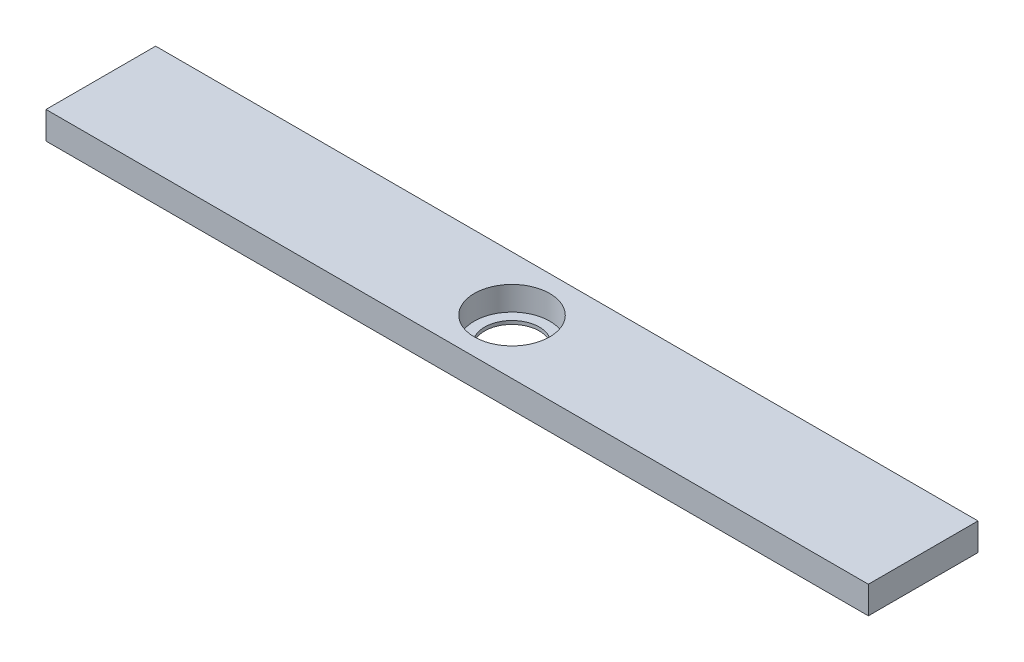
ISO-10303-21;
HEADER;
FILE_DESCRIPTION(('STEP AP214'),'2;1');
FILE_NAME('part.step','',(''),(''),'','','');
FILE_SCHEMA(('AUTOMOTIVE_DESIGN { 1 0 10303 214 1 1 1 1 }'));
ENDSEC;
DATA;
#1=APPLICATION_CONTEXT('core data for automotive mechanical design processes');
#2=APPLICATION_PROTOCOL_DEFINITION('international standard','automotive_design',2000,#1);
#3=PRODUCT_CONTEXT('',#1,'mechanical');
#4=PRODUCT('Part','Part','',(#3));
#5=PRODUCT_RELATED_PRODUCT_CATEGORY('part','',(#4));
#6=PRODUCT_DEFINITION_FORMATION('','',#4);
#7=PRODUCT_DEFINITION_CONTEXT('part definition',#1,'design');
#8=PRODUCT_DEFINITION('design','',#6,#7);
#9=PRODUCT_DEFINITION_SHAPE('','',#8);
#10=(LENGTH_UNIT() NAMED_UNIT(*) SI_UNIT(.MILLI.,.METRE.));
#11=(NAMED_UNIT(*) PLANE_ANGLE_UNIT() SI_UNIT($,.RADIAN.));
#12=(NAMED_UNIT(*) SI_UNIT($,.STERADIAN.) SOLID_ANGLE_UNIT());
#13=UNCERTAINTY_MEASURE_WITH_UNIT(LENGTH_MEASURE(1.E-05),#10,'distance_accuracy_value','');
#14=(GEOMETRIC_REPRESENTATION_CONTEXT(3) GLOBAL_UNCERTAINTY_ASSIGNED_CONTEXT((#13)) GLOBAL_UNIT_ASSIGNED_CONTEXT((#10,
#11,#12)) REPRESENTATION_CONTEXT('',''));
#15=CARTESIAN_POINT('',(0.,0.,0.));
#16=DIRECTION('',(0.,0.,1.));
#17=DIRECTION('',(1.,0.,0.));
#18=AXIS2_PLACEMENT_3D('',#15,#16,#17);
#19=CARTESIAN_POINT('',(190.5,12.7,25.4));
#20=DIRECTION('',(-1.,0.,0.));
#21=DIRECTION('',(0.,0.,1.));
#22=AXIS2_PLACEMENT_3D('',#19,#20,#21);
#23=PLANE('',#22);
#24=DIRECTION('',(0.,0.,-1.));
#25=VECTOR('',#24,1.);
#26=CARTESIAN_POINT('',(190.5,0.,25.4));
#27=LINE('',#26,#25);
#28=CARTESIAN_POINT('',(190.5,0.,25.4));
#29=VERTEX_POINT('',#28);
#30=CARTESIAN_POINT('',(190.5,0.,-25.4));
#31=VERTEX_POINT('',#30);
#32=EDGE_CURVE('E98',#29,#31,#27,.T.);
#33=ORIENTED_EDGE('',*,*,#32,.T.);
#34=DIRECTION('',(0.,-1.,0.));
#35=VECTOR('',#34,1.);
#36=CARTESIAN_POINT('',(190.5,12.7,-25.4));
#37=LINE('',#36,#35);
#38=CARTESIAN_POINT('',(190.5,12.7,-25.4));
#39=VERTEX_POINT('',#38);
#40=EDGE_CURVE('E11',#39,#31,#37,.T.);
#41=ORIENTED_EDGE('',*,*,#40,.F.);
#42=DIRECTION('',(0.,0.,-1.));
#43=VECTOR('',#42,1.);
#44=CARTESIAN_POINT('',(190.5,12.7,25.4));
#45=LINE('',#44,#43);
#46=CARTESIAN_POINT('',(190.5,12.7,25.4));
#47=VERTEX_POINT('',#46);
#48=EDGE_CURVE('E86',#47,#39,#45,.T.);
#49=ORIENTED_EDGE('',*,*,#48,.F.);
#50=DIRECTION('',(0.,-1.,0.));
#51=VECTOR('',#50,1.);
#52=CARTESIAN_POINT('',(190.5,12.7,25.4));
#53=LINE('',#52,#51);
#54=EDGE_CURVE('E94',#47,#29,#53,.T.);
#55=ORIENTED_EDGE('',*,*,#54,.T.);
#56=EDGE_LOOP('',(#33,#41,#49,#55));
#57=FACE_BOUND('',#56,.T.);
#58=ADVANCED_FACE('F35',(#57),#23,.F.);
#59=CARTESIAN_POINT('',(-190.5,12.7,-25.4));
#60=DIRECTION('',(0.,0.,1.));
#61=DIRECTION('',(1.,0.,0.));
#62=AXIS2_PLACEMENT_3D('',#59,#60,#61);
#63=PLANE('',#62);
#64=DIRECTION('',(-1.,0.,0.));
#65=VECTOR('',#64,1.);
#66=CARTESIAN_POINT('',(-190.5,0.,-25.4));
#67=LINE('',#66,#65);
#68=CARTESIAN_POINT('',(-190.5,0.,-25.4));
#69=VERTEX_POINT('',#68);
#70=EDGE_CURVE('E90',#31,#69,#67,.T.);
#71=ORIENTED_EDGE('',*,*,#70,.T.);
#72=DIRECTION('',(0.,-1.,0.));
#73=VECTOR('',#72,1.);
#74=CARTESIAN_POINT('',(-190.5,12.7,-25.4));
#75=LINE('',#74,#73);
#76=CARTESIAN_POINT('',(-190.5,12.7,-25.4));
#77=VERTEX_POINT('',#76);
#78=EDGE_CURVE('E43',#77,#69,#75,.T.);
#79=ORIENTED_EDGE('',*,*,#78,.F.);
#80=DIRECTION('',(-1.,0.,0.));
#81=VECTOR('',#80,1.);
#82=CARTESIAN_POINT('',(-190.5,12.7,-25.4));
#83=LINE('',#82,#81);
#84=EDGE_CURVE('E81',#39,#77,#83,.T.);
#85=ORIENTED_EDGE('',*,*,#84,.F.);
#86=ORIENTED_EDGE('',*,*,#40,.T.);
#87=EDGE_LOOP('',(#71,#79,#85,#86));
#88=FACE_BOUND('',#87,.T.);
#89=ADVANCED_FACE('F89',(#88),#63,.F.);
#90=CARTESIAN_POINT('',(-190.5,12.7,25.4));
#91=DIRECTION('',(1.,0.,0.));
#92=DIRECTION('',(0.,0.,-1.));
#93=AXIS2_PLACEMENT_3D('',#90,#91,#92);
#94=PLANE('',#93);
#95=DIRECTION('',(0.,0.,1.));
#96=VECTOR('',#95,1.);
#97=CARTESIAN_POINT('',(-190.5,0.,25.4));
#98=LINE('',#97,#96);
#99=CARTESIAN_POINT('',(-190.5,0.,25.4));
#100=VERTEX_POINT('',#99);
#101=EDGE_CURVE('E68',#69,#100,#98,.T.);
#102=ORIENTED_EDGE('',*,*,#101,.T.);
#103=DIRECTION('',(0.,-1.,0.));
#104=VECTOR('',#103,1.);
#105=CARTESIAN_POINT('',(-190.5,12.7,25.4));
#106=LINE('',#105,#104);
#107=CARTESIAN_POINT('',(-190.5,12.7,25.4));
#108=VERTEX_POINT('',#107);
#109=EDGE_CURVE('E91',#108,#100,#106,.T.);
#110=ORIENTED_EDGE('',*,*,#109,.F.);
#111=DIRECTION('',(0.,0.,1.));
#112=VECTOR('',#111,1.);
#113=CARTESIAN_POINT('',(-190.5,12.7,25.4));
#114=LINE('',#113,#112);
#115=EDGE_CURVE('E84',#77,#108,#114,.T.);
#116=ORIENTED_EDGE('',*,*,#115,.F.);
#117=ORIENTED_EDGE('',*,*,#78,.T.);
#118=EDGE_LOOP('',(#102,#110,#116,#117));
#119=FACE_BOUND('',#118,.T.);
#120=ADVANCED_FACE('F92',(#119),#94,.F.);
#121=CARTESIAN_POINT('',(-190.5,12.7,25.4));
#122=DIRECTION('',(0.,0.,-1.));
#123=DIRECTION('',(-1.,0.,0.));
#124=AXIS2_PLACEMENT_3D('',#121,#122,#123);
#125=PLANE('',#124);
#126=DIRECTION('',(1.,0.,0.));
#127=VECTOR('',#126,1.);
#128=CARTESIAN_POINT('',(-190.5,0.,25.4));
#129=LINE('',#128,#127);
#130=EDGE_CURVE('E74',#100,#29,#129,.T.);
#131=ORIENTED_EDGE('',*,*,#130,.T.);
#132=ORIENTED_EDGE('',*,*,#54,.F.);
#133=DIRECTION('',(1.,0.,0.));
#134=VECTOR('',#133,1.);
#135=CARTESIAN_POINT('',(-190.5,12.7,25.4));
#136=LINE('',#135,#134);
#137=EDGE_CURVE('E51',#108,#47,#136,.T.);
#138=ORIENTED_EDGE('',*,*,#137,.F.);
#139=ORIENTED_EDGE('',*,*,#109,.T.);
#140=EDGE_LOOP('',(#131,#132,#138,#139));
#141=FACE_BOUND('',#140,.T.);
#142=ADVANCED_FACE('F106',(#141),#125,.F.);
#143=CARTESIAN_POINT('',(190.5,12.7,-25.4));
#144=DIRECTION('',(0.,-1.,0.));
#145=DIRECTION('',(0.,0.,-1.));
#146=AXIS2_PLACEMENT_3D('',#143,#144,#145);
#147=PLANE('',#146);
#148=CARTESIAN_POINT('',(0.,12.7,0.));
#149=DIRECTION('',(0.,1.,0.));
#150=DIRECTION('',(0.,0.,1.));
#151=AXIS2_PLACEMENT_3D('',#148,#149,#150);
#152=CIRCLE('',#151,17.4625);
#153=CARTESIAN_POINT('',(0.,12.7,17.4625));
#154=VERTEX_POINT('',#153);
#155=EDGE_CURVE('E112',#154,#154,#152,.T.);
#156=ORIENTED_EDGE('',*,*,#155,.F.);
#157=EDGE_LOOP('',(#156));
#158=FACE_BOUND('',#157,.T.);
#159=ORIENTED_EDGE('',*,*,#48,.T.);
#160=ORIENTED_EDGE('',*,*,#84,.T.);
#161=ORIENTED_EDGE('',*,*,#115,.T.);
#162=ORIENTED_EDGE('',*,*,#137,.T.);
#163=EDGE_LOOP('',(#159,#160,#161,#162));
#164=FACE_BOUND('',#163,.T.);
#165=ADVANCED_FACE('F82',(#158,#164),#147,.F.);
#166=CARTESIAN_POINT('',(190.5,0.,-25.4));
#167=DIRECTION('',(0.,-1.,0.));
#168=DIRECTION('',(0.,0.,-1.));
#169=AXIS2_PLACEMENT_3D('',#166,#167,#168);
#170=PLANE('',#169);
#171=CARTESIAN_POINT('',(0.,0.,0.));
#172=DIRECTION('',(0.,1.,0.));
#173=DIRECTION('',(0.,0.,1.));
#174=AXIS2_PLACEMENT_3D('',#171,#172,#173);
#175=CIRCLE('',#174,12.7);
#176=CARTESIAN_POINT('',(0.,0.,12.7));
#177=VERTEX_POINT('',#176);
#178=EDGE_CURVE('E115',#177,#177,#175,.T.);
#179=ORIENTED_EDGE('',*,*,#178,.T.);
#180=EDGE_LOOP('',(#179));
#181=FACE_BOUND('',#180,.T.);
#182=ORIENTED_EDGE('',*,*,#32,.F.);
#183=ORIENTED_EDGE('',*,*,#130,.F.);
#184=ORIENTED_EDGE('',*,*,#101,.F.);
#185=ORIENTED_EDGE('',*,*,#70,.F.);
#186=EDGE_LOOP('',(#182,#183,#184,#185));
#187=FACE_BOUND('',#186,.T.);
#188=ADVANCED_FACE('F109',(#181,#187),#170,.T.);
#189=CARTESIAN_POINT('',(0.,1.5875,0.));
#190=DIRECTION('',(0.,1.,0.));
#191=DIRECTION('',(0.,0.,1.));
#192=AXIS2_PLACEMENT_3D('',#189,#190,#191);
#193=CYLINDRICAL_SURFACE('',#192,17.4625);
#194=CARTESIAN_POINT('',(0.,1.5875,0.));
#195=DIRECTION('',(0.,1.,0.));
#196=DIRECTION('',(0.,0.,1.));
#197=AXIS2_PLACEMENT_3D('',#194,#195,#196);
#198=CIRCLE('',#197,17.4625);
#199=CARTESIAN_POINT('',(0.,1.5875,17.4625));
#200=VERTEX_POINT('',#199);
#201=EDGE_CURVE('E101',#200,#200,#198,.T.);
#202=ORIENTED_EDGE('',*,*,#201,.F.);
#203=EDGE_LOOP('',(#202));
#204=FACE_BOUND('',#203,.T.);
#205=ORIENTED_EDGE('',*,*,#155,.T.);
#206=EDGE_LOOP('',(#205));
#207=FACE_BOUND('',#206,.T.);
#208=ADVANCED_FACE('F134',(#204,#207),#193,.F.);
#209=CARTESIAN_POINT('',(0.,1.5875,0.));
#210=DIRECTION('',(0.,1.,0.));
#211=DIRECTION('',(0.,0.,1.));
#212=AXIS2_PLACEMENT_3D('',#209,#210,#211);
#213=PLANE('',#212);
#214=CARTESIAN_POINT('',(0.,1.5875,0.));
#215=DIRECTION('',(0.,1.,0.));
#216=DIRECTION('',(0.,0.,1.));
#217=AXIS2_PLACEMENT_3D('',#214,#215,#216);
#218=CIRCLE('',#217,12.7);
#219=CARTESIAN_POINT('',(0.,1.5875,12.7));
#220=VERTEX_POINT('',#219);
#221=EDGE_CURVE('E118',#220,#220,#218,.T.);
#222=ORIENTED_EDGE('',*,*,#221,.F.);
#223=EDGE_LOOP('',(#222));
#224=FACE_BOUND('',#223,.T.);
#225=ORIENTED_EDGE('',*,*,#201,.T.);
#226=EDGE_LOOP('',(#225));
#227=FACE_BOUND('',#226,.T.);
#228=ADVANCED_FACE('F128',(#224,#227),#213,.T.);
#229=CARTESIAN_POINT('',(0.,0.,0.));
#230=DIRECTION('',(0.,1.,0.));
#231=DIRECTION('',(0.,0.,1.));
#232=AXIS2_PLACEMENT_3D('',#229,#230,#231);
#233=CYLINDRICAL_SURFACE('',#232,12.7);
#234=ORIENTED_EDGE('',*,*,#178,.F.);
#235=EDGE_LOOP('',(#234));
#236=FACE_BOUND('',#235,.T.);
#237=ORIENTED_EDGE('',*,*,#221,.T.);
#238=EDGE_LOOP('',(#237));
#239=FACE_BOUND('',#238,.T.);
#240=ADVANCED_FACE('F125',(#236,#239),#233,.F.);
#241=CLOSED_SHELL('',(#58,#89,#120,#142,#165,#188,#208,#228,#240));
#242=MANIFOLD_SOLID_BREP('B2',#241);
#243=ADVANCED_BREP_SHAPE_REPRESENTATION('',(#18,#242),#14);
#244=SHAPE_DEFINITION_REPRESENTATION(#9,#243);
ENDSEC;
END-ISO-10303-21;
